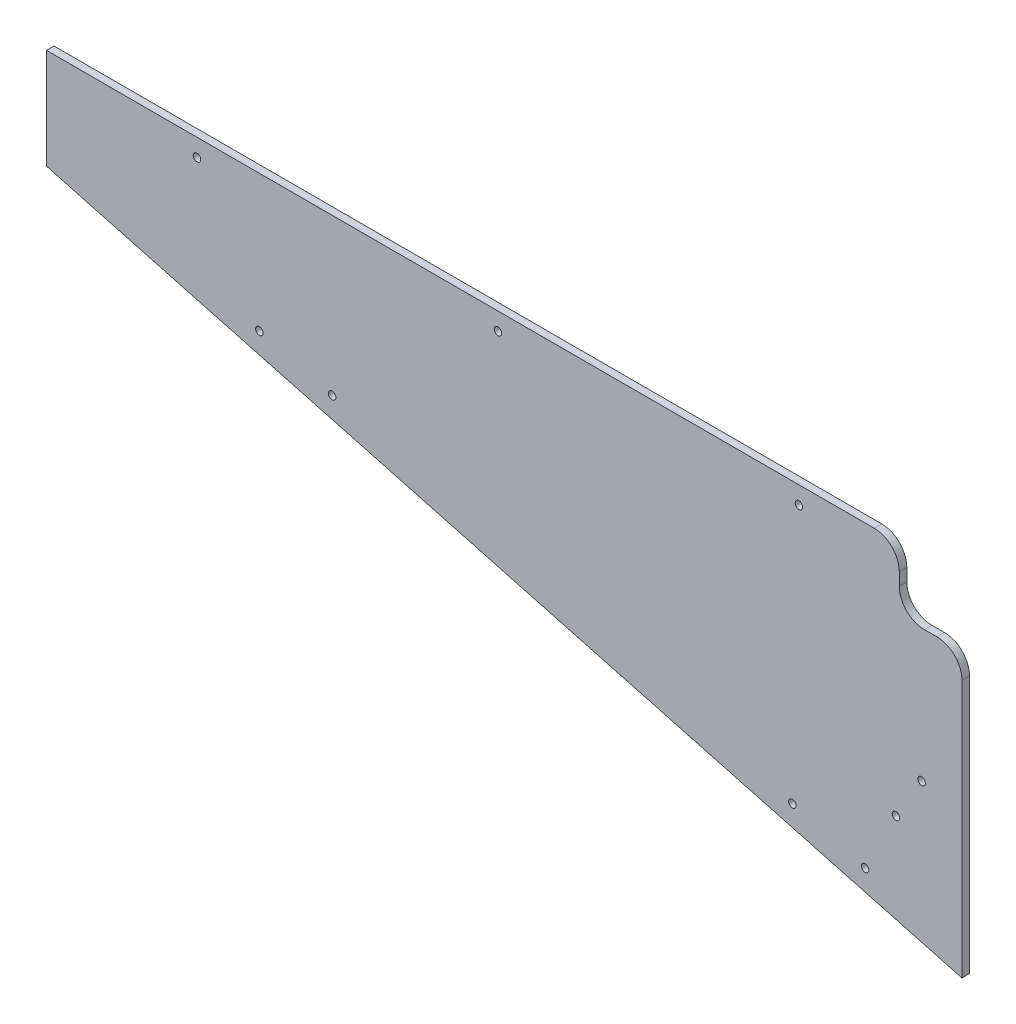
ISO-10303-21;
HEADER;
FILE_DESCRIPTION(('STEP AP214'),'2;1');
FILE_NAME('part.step','',(''),(''),'','','');
FILE_SCHEMA(('AUTOMOTIVE_DESIGN { 1 0 10303 214 1 1 1 1 }'));
ENDSEC;
DATA;
#1=APPLICATION_CONTEXT('core data for automotive mechanical design processes');
#2=APPLICATION_PROTOCOL_DEFINITION('international standard','automotive_design',2000,#1);
#3=PRODUCT_CONTEXT('',#1,'mechanical');
#4=PRODUCT('Part','Part','',(#3));
#5=PRODUCT_RELATED_PRODUCT_CATEGORY('part','',(#4));
#6=PRODUCT_DEFINITION_FORMATION('','',#4);
#7=PRODUCT_DEFINITION_CONTEXT('part definition',#1,'design');
#8=PRODUCT_DEFINITION('design','',#6,#7);
#9=PRODUCT_DEFINITION_SHAPE('','',#8);
#10=(LENGTH_UNIT() NAMED_UNIT(*) SI_UNIT(.MILLI.,.METRE.));
#11=(NAMED_UNIT(*) PLANE_ANGLE_UNIT() SI_UNIT($,.RADIAN.));
#12=(NAMED_UNIT(*) SI_UNIT($,.STERADIAN.) SOLID_ANGLE_UNIT());
#13=UNCERTAINTY_MEASURE_WITH_UNIT(LENGTH_MEASURE(1.E-05),#10,'distance_accuracy_value','');
#14=(GEOMETRIC_REPRESENTATION_CONTEXT(3) GLOBAL_UNCERTAINTY_ASSIGNED_CONTEXT((#13)) GLOBAL_UNIT_ASSIGNED_CONTEXT((#10,
#11,#12)) REPRESENTATION_CONTEXT('',''));
#15=CARTESIAN_POINT('',(0.,0.,0.));
#16=DIRECTION('',(0.,0.,1.));
#17=DIRECTION('',(1.,0.,0.));
#18=AXIS2_PLACEMENT_3D('',#15,#16,#17);
#19=CARTESIAN_POINT('',(0.,0.,3.));
#20=DIRECTION('',(0.,-1.,0.));
#21=DIRECTION('',(1.,0.,0.));
#22=AXIS2_PLACEMENT_3D('',#19,#20,#21);
#23=PLANE('',#22);
#24=DIRECTION('',(-1.,0.,0.));
#25=VECTOR('',#24,1.);
#26=CARTESIAN_POINT('',(0.,0.,3.));
#27=LINE('',#26,#25);
#28=CARTESIAN_POINT('',(-35.,0.,3.));
#29=VERTEX_POINT('',#28);
#30=CARTESIAN_POINT('',(-365.,0.,3.));
#31=VERTEX_POINT('',#30);
#32=EDGE_CURVE('E117',#29,#31,#27,.T.);
#33=ORIENTED_EDGE('',*,*,#32,.F.);
#34=DIRECTION('',(0.,0.,1.));
#35=VECTOR('',#34,1.);
#36=CARTESIAN_POINT('',(-35.,0.,3.));
#37=LINE('',#36,#35);
#38=CARTESIAN_POINT('',(-35.,0.,0.));
#39=VERTEX_POINT('',#38);
#40=EDGE_CURVE('E61',#29,#39,#37,.F.);
#41=ORIENTED_EDGE('',*,*,#40,.T.);
#42=DIRECTION('',(-1.,0.,0.));
#43=VECTOR('',#42,1.);
#44=CARTESIAN_POINT('',(0.,0.,0.));
#45=LINE('',#44,#43);
#46=CARTESIAN_POINT('',(-365.,0.,0.));
#47=VERTEX_POINT('',#46);
#48=EDGE_CURVE('E139',#39,#47,#45,.T.);
#49=ORIENTED_EDGE('',*,*,#48,.T.);
#50=DIRECTION('',(0.,0.,-1.));
#51=VECTOR('',#50,1.);
#52=CARTESIAN_POINT('',(-365.,0.,3.));
#53=LINE('',#52,#51);
#54=EDGE_CURVE('E132',#31,#47,#53,.T.);
#55=ORIENTED_EDGE('',*,*,#54,.F.);
#56=EDGE_LOOP('',(#33,#41,#49,#55));
#57=FACE_BOUND('',#56,.T.);
#58=ADVANCED_FACE('F43',(#57),#23,.F.);
#59=CARTESIAN_POINT('',(-365.,0.,3.));
#60=DIRECTION('',(1.,0.,0.));
#61=DIRECTION('',(0.,0.,-1.));
#62=AXIS2_PLACEMENT_3D('',#59,#60,#61);
#63=PLANE('',#62);
#64=DIRECTION('',(0.,-1.,0.));
#65=VECTOR('',#64,1.);
#66=CARTESIAN_POINT('',(-365.,0.,0.));
#67=LINE('',#66,#65);
#68=CARTESIAN_POINT('',(-365.,-40.,0.));
#69=VERTEX_POINT('',#68);
#70=EDGE_CURVE('E232',#47,#69,#67,.T.);
#71=ORIENTED_EDGE('',*,*,#70,.T.);
#72=DIRECTION('',(0.,0.,-1.));
#73=VECTOR('',#72,1.);
#74=CARTESIAN_POINT('',(-365.,-40.,3.));
#75=LINE('',#74,#73);
#76=CARTESIAN_POINT('',(-365.,-40.,3.));
#77=VERTEX_POINT('',#76);
#78=EDGE_CURVE('E134',#77,#69,#75,.T.);
#79=ORIENTED_EDGE('',*,*,#78,.F.);
#80=DIRECTION('',(0.,-1.,0.));
#81=VECTOR('',#80,1.);
#82=CARTESIAN_POINT('',(-365.,0.,3.));
#83=LINE('',#82,#81);
#84=EDGE_CURVE('E121',#31,#77,#83,.T.);
#85=ORIENTED_EDGE('',*,*,#84,.F.);
#86=ORIENTED_EDGE('',*,*,#54,.T.);
#87=EDGE_LOOP('',(#71,#79,#85,#86));
#88=FACE_BOUND('',#87,.T.);
#89=ADVANCED_FACE('F131',(#88),#63,.F.);
#90=CARTESIAN_POINT('',(-34.4503638093385,-128.570508075687,3.));
#91=DIRECTION('',(0.258819045102514,0.96592582628907,0.));
#92=DIRECTION('',(-0.96592582628907,0.258819045102514,0.));
#93=AXIS2_PLACEMENT_3D('',#90,#91,#92);
#94=PLANE('',#93);
#95=DIRECTION('',(0.96592582628907,-0.258819045102514,0.));
#96=VECTOR('',#95,1.);
#97=CARTESIAN_POINT('',(-34.4503638093385,-128.570508075687,0.));
#98=LINE('',#97,#96);
#99=CARTESIAN_POINT('',(0.,-137.801455237357,0.));
#100=VERTEX_POINT('',#99);
#101=EDGE_CURVE('E235',#69,#100,#98,.T.);
#102=ORIENTED_EDGE('',*,*,#101,.T.);
#103=DIRECTION('',(0.,0.,-1.));
#104=VECTOR('',#103,1.);
#105=CARTESIAN_POINT('',(0.,-137.801455237357,3.));
#106=LINE('',#105,#104);
#107=CARTESIAN_POINT('',(0.,-137.801455237357,3.));
#108=VERTEX_POINT('',#107);
#109=EDGE_CURVE('E148',#108,#100,#106,.T.);
#110=ORIENTED_EDGE('',*,*,#109,.F.);
#111=DIRECTION('',(0.96592582628907,-0.258819045102514,0.));
#112=VECTOR('',#111,1.);
#113=CARTESIAN_POINT('',(-34.4503638093385,-128.570508075687,3.));
#114=LINE('',#113,#112);
#115=EDGE_CURVE('E137',#77,#108,#114,.T.);
#116=ORIENTED_EDGE('',*,*,#115,.F.);
#117=ORIENTED_EDGE('',*,*,#78,.T.);
#118=EDGE_LOOP('',(#102,#110,#116,#117));
#119=FACE_BOUND('',#118,.T.);
#120=ADVANCED_FACE('F258',(#119),#94,.F.);
#121=CARTESIAN_POINT('',(0.,0.,3.));
#122=DIRECTION('',(-1.,0.,0.));
#123=DIRECTION('',(0.,0.,1.));
#124=AXIS2_PLACEMENT_3D('',#121,#122,#123);
#125=PLANE('',#124);
#126=DIRECTION('',(0.,1.,0.));
#127=VECTOR('',#126,1.);
#128=CARTESIAN_POINT('',(0.,0.,0.));
#129=LINE('',#128,#127);
#130=CARTESIAN_POINT('',(0.,-35.,0.));
#131=VERTEX_POINT('',#130);
#132=EDGE_CURVE('E127',#100,#131,#129,.T.);
#133=ORIENTED_EDGE('',*,*,#132,.T.);
#134=DIRECTION('',(0.,0.,1.));
#135=VECTOR('',#134,1.);
#136=CARTESIAN_POINT('',(0.,-35.,3.));
#137=LINE('',#136,#135);
#138=CARTESIAN_POINT('',(0.,-35.,3.));
#139=VERTEX_POINT('',#138);
#140=EDGE_CURVE('E142',#131,#139,#137,.T.);
#141=ORIENTED_EDGE('',*,*,#140,.T.);
#142=DIRECTION('',(0.,1.,0.));
#143=VECTOR('',#142,1.);
#144=CARTESIAN_POINT('',(0.,0.,3.));
#145=LINE('',#144,#143);
#146=EDGE_CURVE('E227',#108,#139,#145,.T.);
#147=ORIENTED_EDGE('',*,*,#146,.F.);
#148=ORIENTED_EDGE('',*,*,#109,.T.);
#149=EDGE_LOOP('',(#133,#141,#147,#148));
#150=FACE_BOUND('',#149,.T.);
#151=ADVANCED_FACE('F246',(#150),#125,.F.);
#152=CARTESIAN_POINT('',(0.,0.,3.));
#153=DIRECTION('',(0.,0.,1.));
#154=DIRECTION('',(1.,0.,0.));
#155=AXIS2_PLACEMENT_3D('',#152,#153,#154);
#156=PLANE('',#155);
#157=CARTESIAN_POINT('',(-26.3270356035143,-95.0301190841425,3.));
#158=DIRECTION('',(0.,0.,1.));
#159=DIRECTION('',(1.,0.,0.));
#160=AXIS2_PLACEMENT_3D('',#157,#158,#159);
#161=CIRCLE('',#160,1.5);
#162=CARTESIAN_POINT('',(-24.8270356035143,-95.0301190841425,3.));
#163=VERTEX_POINT('',#162);
#164=EDGE_CURVE('E361',#163,#163,#161,.T.);
#165=ORIENTED_EDGE('',*,*,#164,.F.);
#166=EDGE_LOOP('',(#165));
#167=FACE_BOUND('',#166,.T.);
#168=CARTESIAN_POINT('',(-16.0861783061029,-77.8509211455292,3.));
#169=DIRECTION('',(0.,0.,1.));
#170=DIRECTION('',(1.,0.,0.));
#171=AXIS2_PLACEMENT_3D('',#168,#169,#170);
#172=CIRCLE('',#171,1.5);
#173=CARTESIAN_POINT('',(-14.5861783061029,-77.8509211455292,3.));
#174=VERTEX_POINT('',#173);
#175=EDGE_CURVE('E355',#174,#174,#172,.T.);
#176=ORIENTED_EDGE('',*,*,#175,.F.);
#177=EDGE_LOOP('',(#176));
#178=FACE_BOUND('',#177,.T.);
#179=CARTESIAN_POINT('',(-280.11848962383,-54.4617227143474,3.));
#180=DIRECTION('',(0.,0.,1.));
#181=DIRECTION('',(1.,0.,0.));
#182=AXIS2_PLACEMENT_3D('',#179,#180,#181);
#183=CIRCLE('',#182,1.50000000000002);
#184=CARTESIAN_POINT('',(-278.61848962383,-54.4617227143474,3.));
#185=VERTEX_POINT('',#184);
#186=EDGE_CURVE('E344',#185,#185,#183,.T.);
#187=ORIENTED_EDGE('',*,*,#186,.F.);
#188=EDGE_LOOP('',(#187));
#189=FACE_BOUND('',#188,.T.);
#190=CARTESIAN_POINT('',(-251.140714835158,-62.2262940674228,3.));
#191=DIRECTION('',(0.,0.,1.));
#192=DIRECTION('',(1.,0.,0.));
#193=AXIS2_PLACEMENT_3D('',#190,#191,#192);
#194=CIRCLE('',#193,1.5);
#195=CARTESIAN_POINT('',(-249.640714835158,-62.2262940674228,3.));
#196=VERTEX_POINT('',#195);
#197=EDGE_CURVE('E348',#196,#196,#194,.T.);
#198=ORIENTED_EDGE('',*,*,#197,.F.);
#199=EDGE_LOOP('',(#198));
#200=FACE_BOUND('',#199,.T.);
#201=CARTESIAN_POINT('',(-38.6370330515628,-119.166483989976,3.));
#202=DIRECTION('',(0.,0.,1.));
#203=DIRECTION('',(1.,0.,0.));
#204=AXIS2_PLACEMENT_3D('',#201,#202,#203);
#205=CIRCLE('',#204,1.5);
#206=CARTESIAN_POINT('',(-37.1370330515628,-119.166483989976,3.));
#207=VERTEX_POINT('',#206);
#208=EDGE_CURVE('E343',#207,#207,#205,.T.);
#209=ORIENTED_EDGE('',*,*,#208,.F.);
#210=EDGE_LOOP('',(#209));
#211=FACE_BOUND('',#210,.T.);
#212=CARTESIAN_POINT('',(-67.6148078402349,-111.401912636901,3.));
#213=DIRECTION('',(0.,0.,1.));
#214=DIRECTION('',(1.,0.,0.));
#215=AXIS2_PLACEMENT_3D('',#212,#213,#214);
#216=CIRCLE('',#215,1.5);
#217=CARTESIAN_POINT('',(-66.1148078402349,-111.401912636901,3.));
#218=VERTEX_POINT('',#217);
#219=EDGE_CURVE('E185',#218,#218,#216,.T.);
#220=ORIENTED_EDGE('',*,*,#219,.F.);
#221=EDGE_LOOP('',(#220));
#222=FACE_BOUND('',#221,.T.);
#223=CARTESIAN_POINT('',(-305.,-7.,3.));
#224=DIRECTION('',(0.,0.,1.));
#225=DIRECTION('',(1.,0.,0.));
#226=AXIS2_PLACEMENT_3D('',#223,#224,#225);
#227=CIRCLE('',#226,1.50000000000002);
#228=CARTESIAN_POINT('',(-303.5,-7.,3.));
#229=VERTEX_POINT('',#228);
#230=EDGE_CURVE('E330',#229,#229,#227,.T.);
#231=ORIENTED_EDGE('',*,*,#230,.F.);
#232=EDGE_LOOP('',(#231));
#233=FACE_BOUND('',#232,.T.);
#234=CARTESIAN_POINT('',(-185.,-7.,3.));
#235=DIRECTION('',(0.,0.,1.));
#236=DIRECTION('',(1.,0.,0.));
#237=AXIS2_PLACEMENT_3D('',#234,#235,#236);
#238=CIRCLE('',#237,1.50000000000003);
#239=CARTESIAN_POINT('',(-183.5,-7.,3.));
#240=VERTEX_POINT('',#239);
#241=EDGE_CURVE('E206',#240,#240,#238,.T.);
#242=ORIENTED_EDGE('',*,*,#241,.F.);
#243=EDGE_LOOP('',(#242));
#244=FACE_BOUND('',#243,.T.);
#245=CARTESIAN_POINT('',(-65.,-7.,3.));
#246=DIRECTION('',(0.,0.,1.));
#247=DIRECTION('',(1.,0.,0.));
#248=AXIS2_PLACEMENT_3D('',#245,#246,#247);
#249=CIRCLE('',#248,1.50000000000003);
#250=CARTESIAN_POINT('',(-63.5,-7.,3.));
#251=VERTEX_POINT('',#250);
#252=EDGE_CURVE('E195',#251,#251,#249,.T.);
#253=ORIENTED_EDGE('',*,*,#252,.F.);
#254=EDGE_LOOP('',(#253));
#255=FACE_BOUND('',#254,.T.);
#256=ORIENTED_EDGE('',*,*,#146,.T.);
#257=CARTESIAN_POINT('',(-10.,-35.,3.));
#258=DIRECTION('',(0.,0.,1.));
#259=DIRECTION('',(1.,0.,0.));
#260=AXIS2_PLACEMENT_3D('',#257,#258,#259);
#261=CIRCLE('',#260,10.);
#262=CARTESIAN_POINT('',(-10.,-25.,3.));
#263=VERTEX_POINT('',#262);
#264=EDGE_CURVE('E154',#139,#263,#261,.T.);
#265=ORIENTED_EDGE('',*,*,#264,.T.);
#266=DIRECTION('',(1.,0.,0.));
#267=VECTOR('',#266,1.);
#268=CARTESIAN_POINT('',(0.,-25.,3.));
#269=LINE('',#268,#267);
#270=CARTESIAN_POINT('',(-15.,-25.,3.));
#271=VERTEX_POINT('',#270);
#272=EDGE_CURVE('E214',#271,#263,#269,.T.);
#273=ORIENTED_EDGE('',*,*,#272,.F.);
#274=CARTESIAN_POINT('',(-15.,-15.,3.));
#275=DIRECTION('',(0.,0.,1.));
#276=DIRECTION('',(1.,0.,0.));
#277=AXIS2_PLACEMENT_3D('',#274,#275,#276);
#278=CIRCLE('',#277,10.);
#279=CARTESIAN_POINT('',(-25.,-15.,3.));
#280=VERTEX_POINT('',#279);
#281=EDGE_CURVE('E53',#271,#280,#278,.F.);
#282=ORIENTED_EDGE('',*,*,#281,.T.);
#283=DIRECTION('',(0.,-1.,0.));
#284=VECTOR('',#283,1.);
#285=CARTESIAN_POINT('',(-25.,0.,3.));
#286=LINE('',#285,#284);
#287=CARTESIAN_POINT('',(-25.,-10.,3.));
#288=VERTEX_POINT('',#287);
#289=EDGE_CURVE('E218',#288,#280,#286,.T.);
#290=ORIENTED_EDGE('',*,*,#289,.F.);
#291=CARTESIAN_POINT('',(-35.,-10.,3.));
#292=DIRECTION('',(0.,0.,1.));
#293=DIRECTION('',(1.,0.,0.));
#294=AXIS2_PLACEMENT_3D('',#291,#292,#293);
#295=CIRCLE('',#294,10.);
#296=EDGE_CURVE('E124',#288,#29,#295,.T.);
#297=ORIENTED_EDGE('',*,*,#296,.T.);
#298=ORIENTED_EDGE('',*,*,#32,.T.);
#299=ORIENTED_EDGE('',*,*,#84,.T.);
#300=ORIENTED_EDGE('',*,*,#115,.T.);
#301=EDGE_LOOP('',(#256,#265,#273,#282,#290,#297,#298,#299,#300));
#302=FACE_BOUND('',#301,.T.);
#303=ADVANCED_FACE('F120',(#167,#178,#189,#200,#211,#222,#233,#244,#255,#302),#156,.T.);
#304=CARTESIAN_POINT('',(0.,0.,0.));
#305=DIRECTION('',(0.,0.,1.));
#306=DIRECTION('',(1.,0.,0.));
#307=AXIS2_PLACEMENT_3D('',#304,#305,#306);
#308=PLANE('',#307);
#309=CARTESIAN_POINT('',(-26.3270356035143,-95.0301190841425,0.));
#310=DIRECTION('',(0.,0.,1.));
#311=DIRECTION('',(1.,0.,0.));
#312=AXIS2_PLACEMENT_3D('',#309,#310,#311);
#313=CIRCLE('',#312,1.5);
#314=CARTESIAN_POINT('',(-24.8270356035143,-95.0301190841425,0.));
#315=VERTEX_POINT('',#314);
#316=EDGE_CURVE('E311',#315,#315,#313,.T.);
#317=ORIENTED_EDGE('',*,*,#316,.T.);
#318=EDGE_LOOP('',(#317));
#319=FACE_BOUND('',#318,.T.);
#320=CARTESIAN_POINT('',(-16.0861783061029,-77.8509211455292,0.));
#321=DIRECTION('',(0.,0.,1.));
#322=DIRECTION('',(1.,0.,0.));
#323=AXIS2_PLACEMENT_3D('',#320,#321,#322);
#324=CIRCLE('',#323,1.5);
#325=CARTESIAN_POINT('',(-14.5861783061029,-77.8509211455292,0.));
#326=VERTEX_POINT('',#325);
#327=EDGE_CURVE('E314',#326,#326,#324,.T.);
#328=ORIENTED_EDGE('',*,*,#327,.T.);
#329=EDGE_LOOP('',(#328));
#330=FACE_BOUND('',#329,.T.);
#331=CARTESIAN_POINT('',(-280.11848962383,-54.4617227143474,0.));
#332=DIRECTION('',(0.,0.,1.));
#333=DIRECTION('',(1.,0.,0.));
#334=AXIS2_PLACEMENT_3D('',#331,#332,#333);
#335=CIRCLE('',#334,1.50000000000002);
#336=CARTESIAN_POINT('',(-278.61848962383,-54.4617227143474,0.));
#337=VERTEX_POINT('',#336);
#338=EDGE_CURVE('E47',#337,#337,#335,.T.);
#339=ORIENTED_EDGE('',*,*,#338,.T.);
#340=EDGE_LOOP('',(#339));
#341=FACE_BOUND('',#340,.T.);
#342=CARTESIAN_POINT('',(-251.140714835158,-62.2262940674228,0.));
#343=DIRECTION('',(0.,0.,1.));
#344=DIRECTION('',(1.,0.,0.));
#345=AXIS2_PLACEMENT_3D('',#342,#343,#344);
#346=CIRCLE('',#345,1.5);
#347=CARTESIAN_POINT('',(-249.640714835158,-62.2262940674228,0.));
#348=VERTEX_POINT('',#347);
#349=EDGE_CURVE('E188',#348,#348,#346,.T.);
#350=ORIENTED_EDGE('',*,*,#349,.T.);
#351=EDGE_LOOP('',(#350));
#352=FACE_BOUND('',#351,.T.);
#353=CARTESIAN_POINT('',(-38.6370330515628,-119.166483989976,0.));
#354=DIRECTION('',(0.,0.,1.));
#355=DIRECTION('',(1.,0.,0.));
#356=AXIS2_PLACEMENT_3D('',#353,#354,#355);
#357=CIRCLE('',#356,1.5);
#358=CARTESIAN_POINT('',(-37.1370330515628,-119.166483989976,0.));
#359=VERTEX_POINT('',#358);
#360=EDGE_CURVE('E184',#359,#359,#357,.T.);
#361=ORIENTED_EDGE('',*,*,#360,.T.);
#362=EDGE_LOOP('',(#361));
#363=FACE_BOUND('',#362,.T.);
#364=CARTESIAN_POINT('',(-67.6148078402349,-111.401912636901,0.));
#365=DIRECTION('',(0.,0.,1.));
#366=DIRECTION('',(1.,0.,0.));
#367=AXIS2_PLACEMENT_3D('',#364,#365,#366);
#368=CIRCLE('',#367,1.5);
#369=CARTESIAN_POINT('',(-66.1148078402349,-111.401912636901,0.));
#370=VERTEX_POINT('',#369);
#371=EDGE_CURVE('E180',#370,#370,#368,.T.);
#372=ORIENTED_EDGE('',*,*,#371,.T.);
#373=EDGE_LOOP('',(#372));
#374=FACE_BOUND('',#373,.T.);
#375=CARTESIAN_POINT('',(-305.,-7.,0.));
#376=DIRECTION('',(0.,0.,1.));
#377=DIRECTION('',(1.,0.,0.));
#378=AXIS2_PLACEMENT_3D('',#375,#376,#377);
#379=CIRCLE('',#378,1.50000000000002);
#380=CARTESIAN_POINT('',(-303.5,-7.,0.));
#381=VERTEX_POINT('',#380);
#382=EDGE_CURVE('E221',#381,#381,#379,.T.);
#383=ORIENTED_EDGE('',*,*,#382,.T.);
#384=EDGE_LOOP('',(#383));
#385=FACE_BOUND('',#384,.T.);
#386=CARTESIAN_POINT('',(-185.,-7.,0.));
#387=DIRECTION('',(0.,0.,1.));
#388=DIRECTION('',(1.,0.,0.));
#389=AXIS2_PLACEMENT_3D('',#386,#387,#388);
#390=CIRCLE('',#389,1.50000000000003);
#391=CARTESIAN_POINT('',(-183.5,-7.,0.));
#392=VERTEX_POINT('',#391);
#393=EDGE_CURVE('E326',#392,#392,#390,.T.);
#394=ORIENTED_EDGE('',*,*,#393,.T.);
#395=EDGE_LOOP('',(#394));
#396=FACE_BOUND('',#395,.T.);
#397=CARTESIAN_POINT('',(-65.,-7.,0.));
#398=DIRECTION('',(0.,0.,1.));
#399=DIRECTION('',(1.,0.,0.));
#400=AXIS2_PLACEMENT_3D('',#397,#398,#399);
#401=CIRCLE('',#400,1.50000000000003);
#402=CARTESIAN_POINT('',(-63.5,-7.,0.));
#403=VERTEX_POINT('',#402);
#404=EDGE_CURVE('E200',#403,#403,#401,.T.);
#405=ORIENTED_EDGE('',*,*,#404,.T.);
#406=EDGE_LOOP('',(#405));
#407=FACE_BOUND('',#406,.T.);
#408=DIRECTION('',(1.,0.,0.));
#409=VECTOR('',#408,1.);
#410=CARTESIAN_POINT('',(0.,-25.,0.));
#411=LINE('',#410,#409);
#412=CARTESIAN_POINT('',(-15.,-25.,0.));
#413=VERTEX_POINT('',#412);
#414=CARTESIAN_POINT('',(-10.,-25.,0.));
#415=VERTEX_POINT('',#414);
#416=EDGE_CURVE('E213',#413,#415,#411,.T.);
#417=ORIENTED_EDGE('',*,*,#416,.T.);
#418=CARTESIAN_POINT('',(-10.,-35.,0.));
#419=DIRECTION('',(0.,0.,1.));
#420=DIRECTION('',(1.,0.,0.));
#421=AXIS2_PLACEMENT_3D('',#418,#419,#420);
#422=CIRCLE('',#421,10.);
#423=EDGE_CURVE('E167',#415,#131,#422,.F.);
#424=ORIENTED_EDGE('',*,*,#423,.T.);
#425=ORIENTED_EDGE('',*,*,#132,.F.);
#426=ORIENTED_EDGE('',*,*,#101,.F.);
#427=ORIENTED_EDGE('',*,*,#70,.F.);
#428=ORIENTED_EDGE('',*,*,#48,.F.);
#429=CARTESIAN_POINT('',(-35.,-10.,0.));
#430=DIRECTION('',(0.,0.,1.));
#431=DIRECTION('',(1.,0.,0.));
#432=AXIS2_PLACEMENT_3D('',#429,#430,#431);
#433=CIRCLE('',#432,10.);
#434=CARTESIAN_POINT('',(-25.,-10.,0.));
#435=VERTEX_POINT('',#434);
#436=EDGE_CURVE('E164',#39,#435,#433,.F.);
#437=ORIENTED_EDGE('',*,*,#436,.T.);
#438=DIRECTION('',(0.,-1.,0.));
#439=VECTOR('',#438,1.);
#440=CARTESIAN_POINT('',(-25.,0.,0.));
#441=LINE('',#440,#439);
#442=CARTESIAN_POINT('',(-25.,-15.,0.));
#443=VERTEX_POINT('',#442);
#444=EDGE_CURVE('E210',#435,#443,#441,.T.);
#445=ORIENTED_EDGE('',*,*,#444,.T.);
#446=CARTESIAN_POINT('',(-15.,-15.,0.));
#447=DIRECTION('',(0.,0.,1.));
#448=DIRECTION('',(1.,0.,0.));
#449=AXIS2_PLACEMENT_3D('',#446,#447,#448);
#450=CIRCLE('',#449,10.);
#451=EDGE_CURVE('E11',#443,#413,#450,.T.);
#452=ORIENTED_EDGE('',*,*,#451,.T.);
#453=EDGE_LOOP('',(#417,#424,#425,#426,#427,#428,#437,#445,#452));
#454=FACE_BOUND('',#453,.T.);
#455=ADVANCED_FACE('F251',(#319,#330,#341,#352,#363,#374,#385,#396,#407,#454),#308,.F.);
#456=CARTESIAN_POINT('',(0.,-25.,0.));
#457=DIRECTION('',(0.,-1.,0.));
#458=DIRECTION('',(1.,0.,0.));
#459=AXIS2_PLACEMENT_3D('',#456,#457,#458);
#460=PLANE('',#459);
#461=ORIENTED_EDGE('',*,*,#272,.T.);
#462=DIRECTION('',(0.,0.,1.));
#463=VECTOR('',#462,1.);
#464=CARTESIAN_POINT('',(-10.,-25.,0.));
#465=LINE('',#464,#463);
#466=EDGE_CURVE('E161',#263,#415,#465,.F.);
#467=ORIENTED_EDGE('',*,*,#466,.T.);
#468=ORIENTED_EDGE('',*,*,#416,.F.);
#469=DIRECTION('',(0.,0.,1.));
#470=VECTOR('',#469,1.);
#471=CARTESIAN_POINT('',(-15.,-25.,3.));
#472=LINE('',#471,#470);
#473=EDGE_CURVE('E157',#413,#271,#472,.T.);
#474=ORIENTED_EDGE('',*,*,#473,.T.);
#475=EDGE_LOOP('',(#461,#467,#468,#474));
#476=FACE_BOUND('',#475,.T.);
#477=ADVANCED_FACE('F285',(#476),#460,.F.);
#478=CARTESIAN_POINT('',(-25.,0.,0.));
#479=DIRECTION('',(-1.,0.,0.));
#480=DIRECTION('',(0.,-1.,0.));
#481=AXIS2_PLACEMENT_3D('',#478,#479,#480);
#482=PLANE('',#481);
#483=ORIENTED_EDGE('',*,*,#289,.T.);
#484=DIRECTION('',(0.,0.,1.));
#485=VECTOR('',#484,1.);
#486=CARTESIAN_POINT('',(-25.,-15.,0.));
#487=LINE('',#486,#485);
#488=EDGE_CURVE('E69',#280,#443,#487,.F.);
#489=ORIENTED_EDGE('',*,*,#488,.T.);
#490=ORIENTED_EDGE('',*,*,#444,.F.);
#491=DIRECTION('',(0.,0.,1.));
#492=VECTOR('',#491,1.);
#493=CARTESIAN_POINT('',(-25.,-10.,0.));
#494=LINE('',#493,#492);
#495=EDGE_CURVE('E170',#435,#288,#494,.T.);
#496=ORIENTED_EDGE('',*,*,#495,.T.);
#497=EDGE_LOOP('',(#483,#489,#490,#496));
#498=FACE_BOUND('',#497,.T.);
#499=ADVANCED_FACE('F286',(#498),#482,.F.);
#500=CARTESIAN_POINT('',(-65.,-7.,0.));
#501=DIRECTION('',(0.,0.,1.));
#502=DIRECTION('',(1.,0.,0.));
#503=AXIS2_PLACEMENT_3D('',#500,#501,#502);
#504=CYLINDRICAL_SURFACE('',#503,1.50000000000003);
#505=ORIENTED_EDGE('',*,*,#404,.F.);
#506=EDGE_LOOP('',(#505));
#507=FACE_BOUND('',#506,.T.);
#508=ORIENTED_EDGE('',*,*,#252,.T.);
#509=EDGE_LOOP('',(#508));
#510=FACE_BOUND('',#509,.T.);
#511=ADVANCED_FACE('F290',(#507,#510),#504,.F.);
#512=CARTESIAN_POINT('',(-185.,-7.,0.));
#513=DIRECTION('',(0.,0.,1.));
#514=DIRECTION('',(1.,0.,0.));
#515=AXIS2_PLACEMENT_3D('',#512,#513,#514);
#516=CYLINDRICAL_SURFACE('',#515,1.50000000000003);
#517=ORIENTED_EDGE('',*,*,#393,.F.);
#518=EDGE_LOOP('',(#517));
#519=FACE_BOUND('',#518,.T.);
#520=ORIENTED_EDGE('',*,*,#241,.T.);
#521=EDGE_LOOP('',(#520));
#522=FACE_BOUND('',#521,.T.);
#523=ADVANCED_FACE('F296',(#519,#522),#516,.F.);
#524=CARTESIAN_POINT('',(-305.,-7.,0.));
#525=DIRECTION('',(0.,0.,1.));
#526=DIRECTION('',(1.,0.,0.));
#527=AXIS2_PLACEMENT_3D('',#524,#525,#526);
#528=CYLINDRICAL_SURFACE('',#527,1.50000000000002);
#529=ORIENTED_EDGE('',*,*,#382,.F.);
#530=EDGE_LOOP('',(#529));
#531=FACE_BOUND('',#530,.T.);
#532=ORIENTED_EDGE('',*,*,#230,.T.);
#533=EDGE_LOOP('',(#532));
#534=FACE_BOUND('',#533,.T.);
#535=ADVANCED_FACE('F274',(#531,#534),#528,.F.);
#536=CARTESIAN_POINT('',(-10.,-35.,3.));
#537=DIRECTION('',(0.,0.,1.));
#538=DIRECTION('',(1.,0.,0.));
#539=AXIS2_PLACEMENT_3D('',#536,#537,#538);
#540=CYLINDRICAL_SURFACE('',#539,10.);
#541=ORIENTED_EDGE('',*,*,#423,.F.);
#542=ORIENTED_EDGE('',*,*,#466,.F.);
#543=ORIENTED_EDGE('',*,*,#264,.F.);
#544=ORIENTED_EDGE('',*,*,#140,.F.);
#545=EDGE_LOOP('',(#541,#542,#543,#544));
#546=FACE_BOUND('',#545,.T.);
#547=ADVANCED_FACE('F256',(#546),#540,.T.);
#548=CARTESIAN_POINT('',(-15.,-15.,0.));
#549=DIRECTION('',(0.,0.,-1.));
#550=DIRECTION('',(-1.,0.,0.));
#551=AXIS2_PLACEMENT_3D('',#548,#549,#550);
#552=CYLINDRICAL_SURFACE('',#551,10.);
#553=ORIENTED_EDGE('',*,*,#451,.F.);
#554=ORIENTED_EDGE('',*,*,#488,.F.);
#555=ORIENTED_EDGE('',*,*,#281,.F.);
#556=ORIENTED_EDGE('',*,*,#473,.F.);
#557=EDGE_LOOP('',(#553,#554,#555,#556));
#558=FACE_BOUND('',#557,.T.);
#559=ADVANCED_FACE('F273',(#558),#552,.F.);
#560=CARTESIAN_POINT('',(-35.,-10.,0.));
#561=DIRECTION('',(0.,0.,1.));
#562=DIRECTION('',(1.,0.,0.));
#563=AXIS2_PLACEMENT_3D('',#560,#561,#562);
#564=CYLINDRICAL_SURFACE('',#563,10.);
#565=ORIENTED_EDGE('',*,*,#436,.F.);
#566=ORIENTED_EDGE('',*,*,#40,.F.);
#567=ORIENTED_EDGE('',*,*,#296,.F.);
#568=ORIENTED_EDGE('',*,*,#495,.F.);
#569=EDGE_LOOP('',(#565,#566,#567,#568));
#570=FACE_BOUND('',#569,.T.);
#571=ADVANCED_FACE('F45',(#570),#564,.T.);
#572=CARTESIAN_POINT('',(-67.6148078402349,-111.401912636901,-7.));
#573=DIRECTION('',(0.,0.,1.));
#574=DIRECTION('',(1.,0.,0.));
#575=AXIS2_PLACEMENT_3D('',#572,#573,#574);
#576=CYLINDRICAL_SURFACE('',#575,1.5);
#577=ORIENTED_EDGE('',*,*,#219,.T.);
#578=EDGE_LOOP('',(#577));
#579=FACE_BOUND('',#578,.T.);
#580=ORIENTED_EDGE('',*,*,#371,.F.);
#581=EDGE_LOOP('',(#580));
#582=FACE_BOUND('',#581,.T.);
#583=ADVANCED_FACE('F280',(#579,#582),#576,.F.);
#584=CARTESIAN_POINT('',(-38.6370330515628,-119.166483989976,-7.));
#585=DIRECTION('',(0.,0.,1.));
#586=DIRECTION('',(1.,0.,0.));
#587=AXIS2_PLACEMENT_3D('',#584,#585,#586);
#588=CYLINDRICAL_SURFACE('',#587,1.5);
#589=ORIENTED_EDGE('',*,*,#208,.T.);
#590=EDGE_LOOP('',(#589));
#591=FACE_BOUND('',#590,.T.);
#592=ORIENTED_EDGE('',*,*,#360,.F.);
#593=EDGE_LOOP('',(#592));
#594=FACE_BOUND('',#593,.T.);
#595=ADVANCED_FACE('F395',(#591,#594),#588,.F.);
#596=CARTESIAN_POINT('',(-251.140714835158,-62.2262940674228,-7.));
#597=DIRECTION('',(0.,0.,1.));
#598=DIRECTION('',(1.,0.,0.));
#599=AXIS2_PLACEMENT_3D('',#596,#597,#598);
#600=CYLINDRICAL_SURFACE('',#599,1.5);
#601=ORIENTED_EDGE('',*,*,#197,.T.);
#602=EDGE_LOOP('',(#601));
#603=FACE_BOUND('',#602,.T.);
#604=ORIENTED_EDGE('',*,*,#349,.F.);
#605=EDGE_LOOP('',(#604));
#606=FACE_BOUND('',#605,.T.);
#607=ADVANCED_FACE('F401',(#603,#606),#600,.F.);
#608=CARTESIAN_POINT('',(-280.11848962383,-54.4617227143474,-7.));
#609=DIRECTION('',(0.,0.,1.));
#610=DIRECTION('',(1.,0.,0.));
#611=AXIS2_PLACEMENT_3D('',#608,#609,#610);
#612=CYLINDRICAL_SURFACE('',#611,1.50000000000002);
#613=ORIENTED_EDGE('',*,*,#186,.T.);
#614=EDGE_LOOP('',(#613));
#615=FACE_BOUND('',#614,.T.);
#616=ORIENTED_EDGE('',*,*,#338,.F.);
#617=EDGE_LOOP('',(#616));
#618=FACE_BOUND('',#617,.T.);
#619=ADVANCED_FACE('F397',(#615,#618),#612,.F.);
#620=CARTESIAN_POINT('',(-16.0861783061029,-77.8509211455292,0.));
#621=DIRECTION('',(0.,0.,1.));
#622=DIRECTION('',(1.,0.,0.));
#623=AXIS2_PLACEMENT_3D('',#620,#621,#622);
#624=CYLINDRICAL_SURFACE('',#623,1.5);
#625=ORIENTED_EDGE('',*,*,#327,.F.);
#626=EDGE_LOOP('',(#625));
#627=FACE_BOUND('',#626,.T.);
#628=ORIENTED_EDGE('',*,*,#175,.T.);
#629=EDGE_LOOP('',(#628));
#630=FACE_BOUND('',#629,.T.);
#631=ADVANCED_FACE('F400',(#627,#630),#624,.F.);
#632=CARTESIAN_POINT('',(-26.3270356035143,-95.0301190841425,0.));
#633=DIRECTION('',(0.,0.,1.));
#634=DIRECTION('',(1.,0.,0.));
#635=AXIS2_PLACEMENT_3D('',#632,#633,#634);
#636=CYLINDRICAL_SURFACE('',#635,1.5);
#637=ORIENTED_EDGE('',*,*,#316,.F.);
#638=EDGE_LOOP('',(#637));
#639=FACE_BOUND('',#638,.T.);
#640=ORIENTED_EDGE('',*,*,#164,.T.);
#641=EDGE_LOOP('',(#640));
#642=FACE_BOUND('',#641,.T.);
#643=ADVANCED_FACE('F368',(#639,#642),#636,.F.);
#644=CLOSED_SHELL('',(#58,#89,#120,#151,#303,#455,#477,#499,#511,#523,#535,#547,#559,#571,#583,
#595,#607,#619,#631,#643));
#645=MANIFOLD_SOLID_BREP('B2',#644);
#646=ADVANCED_BREP_SHAPE_REPRESENTATION('',(#18,#645),#14);
#647=SHAPE_DEFINITION_REPRESENTATION(#9,#646);
ENDSEC;
END-ISO-10303-21;
